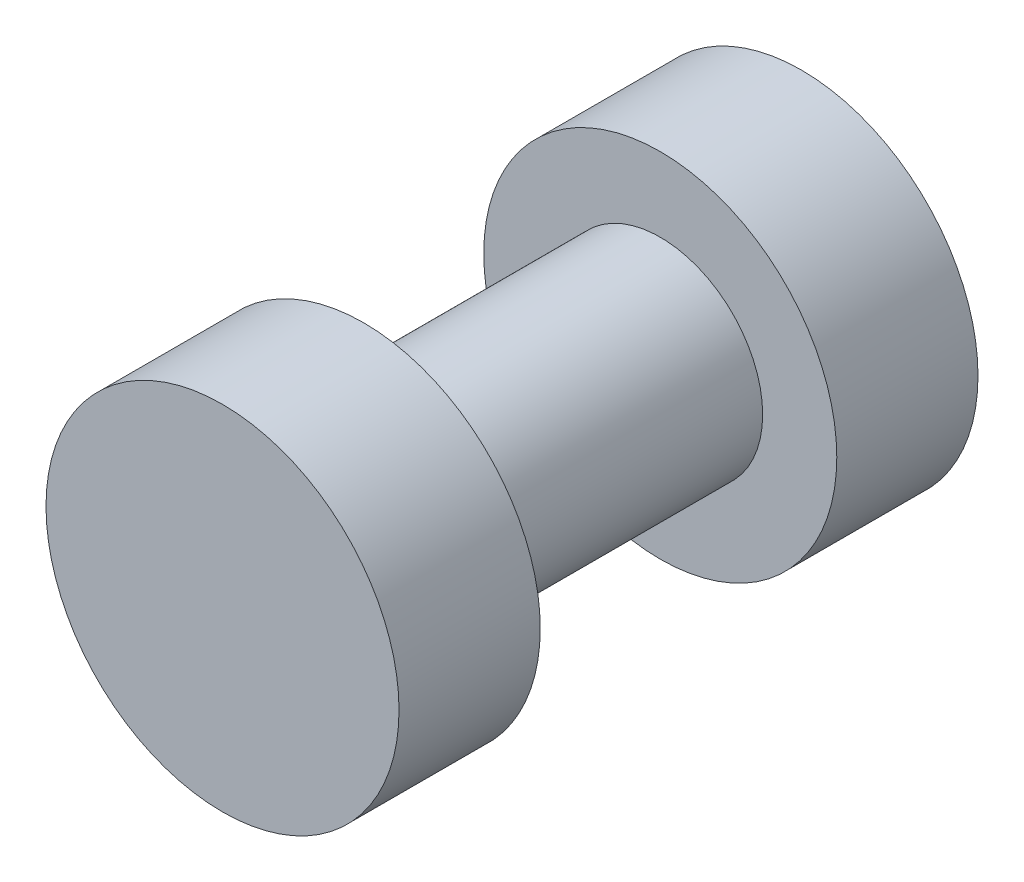
ISO-10303-21;
HEADER;
FILE_DESCRIPTION(('STEP AP214'),'2;1');
FILE_NAME('part.step','',(''),(''),'','','');
FILE_SCHEMA(('AUTOMOTIVE_DESIGN { 1 0 10303 214 1 1 1 1 }'));
ENDSEC;
DATA;
#1=APPLICATION_CONTEXT('core data for automotive mechanical design processes');
#2=APPLICATION_PROTOCOL_DEFINITION('international standard','automotive_design',2000,#1);
#3=PRODUCT_CONTEXT('',#1,'mechanical');
#4=PRODUCT('Part','Part','',(#3));
#5=PRODUCT_RELATED_PRODUCT_CATEGORY('part','',(#4));
#6=PRODUCT_DEFINITION_FORMATION('','',#4);
#7=PRODUCT_DEFINITION_CONTEXT('part definition',#1,'design');
#8=PRODUCT_DEFINITION('design','',#6,#7);
#9=PRODUCT_DEFINITION_SHAPE('','',#8);
#10=(LENGTH_UNIT() NAMED_UNIT(*) SI_UNIT(.MILLI.,.METRE.));
#11=(NAMED_UNIT(*) PLANE_ANGLE_UNIT() SI_UNIT($,.RADIAN.));
#12=(NAMED_UNIT(*) SI_UNIT($,.STERADIAN.) SOLID_ANGLE_UNIT());
#13=UNCERTAINTY_MEASURE_WITH_UNIT(LENGTH_MEASURE(1.E-05),#10,'distance_accuracy_value','');
#14=(GEOMETRIC_REPRESENTATION_CONTEXT(3) GLOBAL_UNCERTAINTY_ASSIGNED_CONTEXT((#13)) GLOBAL_UNIT_ASSIGNED_CONTEXT((#10,
#11,#12)) REPRESENTATION_CONTEXT('',''));
#15=CARTESIAN_POINT('',(0.,0.,0.));
#16=DIRECTION('',(0.,0.,1.));
#17=DIRECTION('',(1.,0.,0.));
#18=AXIS2_PLACEMENT_3D('',#15,#16,#17);
#19=CARTESIAN_POINT('',(0.,0.,10.));
#20=DIRECTION('',(0.,0.,-1.));
#21=DIRECTION('',(-1.,0.,0.));
#22=AXIS2_PLACEMENT_3D('',#19,#20,#21);
#23=CYLINDRICAL_SURFACE('',#22,12.5);
#24=CARTESIAN_POINT('',(0.,0.,10.));
#25=DIRECTION('',(0.,0.,1.));
#26=DIRECTION('',(1.,0.,0.));
#27=AXIS2_PLACEMENT_3D('',#24,#25,#26);
#28=CIRCLE('',#27,12.5);
#29=CARTESIAN_POINT('',(12.5,0.,10.));
#30=VERTEX_POINT('',#29);
#31=EDGE_CURVE('E38',#30,#30,#28,.T.);
#32=ORIENTED_EDGE('',*,*,#31,.F.);
#33=EDGE_LOOP('',(#32));
#34=FACE_BOUND('',#33,.T.);
#35=CARTESIAN_POINT('',(0.,0.,0.));
#36=DIRECTION('',(0.,0.,1.));
#37=DIRECTION('',(1.,0.,0.));
#38=AXIS2_PLACEMENT_3D('',#35,#36,#37);
#39=CIRCLE('',#38,12.5);
#40=CARTESIAN_POINT('',(12.5,0.,0.));
#41=VERTEX_POINT('',#40);
#42=EDGE_CURVE('E34',#41,#41,#39,.T.);
#43=ORIENTED_EDGE('',*,*,#42,.T.);
#44=EDGE_LOOP('',(#43));
#45=FACE_BOUND('',#44,.T.);
#46=ADVANCED_FACE('F31',(#34,#45),#23,.T.);
#47=CARTESIAN_POINT('',(0.,0.,10.));
#48=DIRECTION('',(0.,0.,1.));
#49=DIRECTION('',(1.,0.,0.));
#50=AXIS2_PLACEMENT_3D('',#47,#48,#49);
#51=PLANE('',#50);
#52=CARTESIAN_POINT('',(0.,0.,10.));
#53=DIRECTION('',(0.,0.,1.));
#54=DIRECTION('',(1.,0.,0.));
#55=AXIS2_PLACEMENT_3D('',#52,#53,#54);
#56=CIRCLE('',#55,7.25);
#57=CARTESIAN_POINT('',(-7.25,0.,10.));
#58=VERTEX_POINT('',#57);
#59=EDGE_CURVE('E10',#58,#58,#56,.T.);
#60=ORIENTED_EDGE('',*,*,#59,.F.);
#61=EDGE_LOOP('',(#60));
#62=FACE_BOUND('',#61,.T.);
#63=ORIENTED_EDGE('',*,*,#31,.T.);
#64=EDGE_LOOP('',(#63));
#65=FACE_BOUND('',#64,.T.);
#66=ADVANCED_FACE('F72',(#62,#65),#51,.T.);
#67=CARTESIAN_POINT('',(0.,0.,0.));
#68=DIRECTION('',(0.,0.,1.));
#69=DIRECTION('',(1.,0.,0.));
#70=AXIS2_PLACEMENT_3D('',#67,#68,#69);
#71=PLANE('',#70);
#72=ORIENTED_EDGE('',*,*,#42,.F.);
#73=EDGE_LOOP('',(#72));
#74=FACE_BOUND('',#73,.T.);
#75=ADVANCED_FACE('F77',(#74),#71,.F.);
#76=CARTESIAN_POINT('',(0.,0.,31.));
#77=DIRECTION('',(0.,0.,-1.));
#78=DIRECTION('',(-1.,0.,0.));
#79=AXIS2_PLACEMENT_3D('',#76,#77,#78);
#80=CYLINDRICAL_SURFACE('',#79,7.25);
#81=CARTESIAN_POINT('',(0.,0.,31.));
#82=DIRECTION('',(0.,0.,1.));
#83=DIRECTION('',(1.,0.,0.));
#84=AXIS2_PLACEMENT_3D('',#81,#82,#83);
#85=CIRCLE('',#84,7.25);
#86=CARTESIAN_POINT('',(-7.25,0.,31.));
#87=VERTEX_POINT('',#86);
#88=EDGE_CURVE('E44',#87,#87,#85,.T.);
#89=CARTESIAN_POINT('',(-7.25,0.,31.));
#90=CARTESIAN_POINT('',(-7.25,0.,30.78125));
#91=CARTESIAN_POINT('',(-7.25,0.,30.5625));
#92=CARTESIAN_POINT('',(-7.25,0.,30.125));
#93=CARTESIAN_POINT('',(-7.25,0.,29.90625));
#94=CARTESIAN_POINT('',(-7.25,0.,29.46875));
#95=CARTESIAN_POINT('',(-7.25,0.,29.25));
#96=CARTESIAN_POINT('',(-7.25,0.,28.8125));
#97=CARTESIAN_POINT('',(-7.25,0.,28.59375));
#98=CARTESIAN_POINT('',(-7.25,0.,28.15625));
#99=CARTESIAN_POINT('',(-7.25,0.,27.9375));
#100=CARTESIAN_POINT('',(-7.25,0.,27.5));
#101=CARTESIAN_POINT('',(-7.25,0.,27.28125));
#102=CARTESIAN_POINT('',(-7.25,0.,26.84375));
#103=CARTESIAN_POINT('',(-7.25,0.,26.625));
#104=CARTESIAN_POINT('',(-7.25,0.,26.1875));
#105=CARTESIAN_POINT('',(-7.25,0.,25.96875));
#106=CARTESIAN_POINT('',(-7.25,0.,25.53125));
#107=CARTESIAN_POINT('',(-7.25,0.,25.3125));
#108=CARTESIAN_POINT('',(-7.25,0.,24.875));
#109=CARTESIAN_POINT('',(-7.25,0.,24.65625));
#110=CARTESIAN_POINT('',(-7.25,0.,24.21875));
#111=CARTESIAN_POINT('',(-7.25,0.,24.));
#112=CARTESIAN_POINT('',(-7.25,0.,23.5625));
#113=CARTESIAN_POINT('',(-7.25,0.,23.34375));
#114=CARTESIAN_POINT('',(-7.25,0.,22.90625));
#115=CARTESIAN_POINT('',(-7.25,0.,22.6875));
#116=CARTESIAN_POINT('',(-7.25,0.,22.25));
#117=CARTESIAN_POINT('',(-7.25,0.,22.03125));
#118=CARTESIAN_POINT('',(-7.25,0.,21.59375));
#119=CARTESIAN_POINT('',(-7.25,0.,21.375));
#120=CARTESIAN_POINT('',(-7.25,0.,20.9375));
#121=CARTESIAN_POINT('',(-7.25,0.,20.71875));
#122=CARTESIAN_POINT('',(-7.25,0.,20.28125));
#123=CARTESIAN_POINT('',(-7.25,0.,20.0625));
#124=CARTESIAN_POINT('',(-7.25,0.,19.625));
#125=CARTESIAN_POINT('',(-7.25,0.,19.40625));
#126=CARTESIAN_POINT('',(-7.25,0.,18.96875));
#127=CARTESIAN_POINT('',(-7.25,0.,18.75));
#128=CARTESIAN_POINT('',(-7.25,0.,18.3125));
#129=CARTESIAN_POINT('',(-7.25,0.,18.09375));
#130=CARTESIAN_POINT('',(-7.25,0.,17.65625));
#131=CARTESIAN_POINT('',(-7.25,0.,17.4375));
#132=CARTESIAN_POINT('',(-7.25,0.,17.));
#133=CARTESIAN_POINT('',(-7.25,0.,16.78125));
#134=CARTESIAN_POINT('',(-7.25,0.,16.34375));
#135=CARTESIAN_POINT('',(-7.25,0.,16.125));
#136=CARTESIAN_POINT('',(-7.25,0.,15.6875));
#137=CARTESIAN_POINT('',(-7.25,0.,15.46875));
#138=CARTESIAN_POINT('',(-7.25,0.,15.03125));
#139=CARTESIAN_POINT('',(-7.25,0.,14.8125));
#140=CARTESIAN_POINT('',(-7.25,0.,14.375));
#141=CARTESIAN_POINT('',(-7.25,0.,14.15625));
#142=CARTESIAN_POINT('',(-7.25,0.,13.71875));
#143=CARTESIAN_POINT('',(-7.25,0.,13.5));
#144=CARTESIAN_POINT('',(-7.25,0.,13.0625));
#145=CARTESIAN_POINT('',(-7.25,0.,12.84375));
#146=CARTESIAN_POINT('',(-7.25,0.,12.40625));
#147=CARTESIAN_POINT('',(-7.25,0.,12.1875));
#148=CARTESIAN_POINT('',(-7.25,0.,11.75));
#149=CARTESIAN_POINT('',(-7.25,0.,11.53125));
#150=CARTESIAN_POINT('',(-7.25,0.,11.09375));
#151=CARTESIAN_POINT('',(-7.25,0.,10.875));
#152=CARTESIAN_POINT('',(-7.25,0.,10.4375));
#153=CARTESIAN_POINT('',(-7.25,0.,10.21875));
#154=CARTESIAN_POINT('',(-7.25,0.,10.));
#155=B_SPLINE_CURVE_WITH_KNOTS('',3,(#89,#90,#91,#92,#93,#94,#95,#96,#97,#98,#99,#100,#101,#102,
#103,#104,#105,#106,#107,#108,#109,#110,#111,#112,#113,#114,#115,#116,#117,#118,#119,#120,#121,
#122,#123,#124,#125,#126,#127,#128,#129,#130,#131,#132,#133,#134,#135,#136,#137,#138,#139,#140,
#141,#142,#143,#144,#145,#146,#147,#148,#149,#150,#151,#152,#153,#154),.UNSPECIFIED.,.F.,.F.,(4,
2,2,2,2,2,2,2,2,2,2,2,2,2,2,2,2,2,2,2,2,2,2,2,2,2,2,2,2,2,2,2,4),(0.,0.656249999999997,1.3125,
1.96875,2.625,3.28125,3.9375,4.59375,5.25,5.90625,6.5625,7.21875,7.875,8.53125,9.1875,
9.84374999999999,10.5,11.15625,11.8125,12.46875,13.125,13.78125,14.4375,15.09375,15.75,16.40625,
17.0625,17.71875,18.375,19.03125,19.6875,20.34375,21.),.UNSPECIFIED.);
#156=EDGE_CURVE('BSEAM59',#87,#58,#155,.T.);
#157=ORIENTED_EDGE('',*,*,#88,.F.);
#158=ORIENTED_EDGE('',*,*,#59,.T.);
#159=ORIENTED_EDGE('',*,*,#156,.T.);
#160=ORIENTED_EDGE('',*,*,#156,.F.);
#161=EDGE_LOOP('',(#157,#159,#158,#160));
#162=FACE_BOUND('',#161,.T.);
#163=ADVANCED_FACE('F59',(#162),#80,.T.);
#164=CARTESIAN_POINT('',(0.,0.,41.));
#165=DIRECTION('',(0.,0.,-1.));
#166=DIRECTION('',(-1.,0.,0.));
#167=AXIS2_PLACEMENT_3D('',#164,#165,#166);
#168=CYLINDRICAL_SURFACE('',#167,12.5);
#169=CARTESIAN_POINT('',(0.,0.,41.));
#170=DIRECTION('',(0.,0.,1.));
#171=DIRECTION('',(1.,0.,0.));
#172=AXIS2_PLACEMENT_3D('',#169,#170,#171);
#173=CIRCLE('',#172,12.5);
#174=CARTESIAN_POINT('',(12.5,0.,41.));
#175=VERTEX_POINT('',#174);
#176=EDGE_CURVE('E47',#175,#175,#173,.T.);
#177=ORIENTED_EDGE('',*,*,#176,.F.);
#178=EDGE_LOOP('',(#177));
#179=FACE_BOUND('',#178,.T.);
#180=CARTESIAN_POINT('',(0.,0.,31.));
#181=DIRECTION('',(0.,0.,1.));
#182=DIRECTION('',(1.,0.,0.));
#183=AXIS2_PLACEMENT_3D('',#180,#181,#182);
#184=CIRCLE('',#183,12.5);
#185=CARTESIAN_POINT('',(12.5,0.,31.));
#186=VERTEX_POINT('',#185);
#187=EDGE_CURVE('E48',#186,#186,#184,.T.);
#188=ORIENTED_EDGE('',*,*,#187,.T.);
#189=EDGE_LOOP('',(#188));
#190=FACE_BOUND('',#189,.T.);
#191=ADVANCED_FACE('F56',(#179,#190),#168,.T.);
#192=CARTESIAN_POINT('',(0.,0.,41.));
#193=DIRECTION('',(0.,0.,1.));
#194=DIRECTION('',(1.,0.,0.));
#195=AXIS2_PLACEMENT_3D('',#192,#193,#194);
#196=PLANE('',#195);
#197=ORIENTED_EDGE('',*,*,#176,.T.);
#198=EDGE_LOOP('',(#197));
#199=FACE_BOUND('',#198,.T.);
#200=ADVANCED_FACE('F54',(#199),#196,.T.);
#201=CARTESIAN_POINT('',(0.,0.,31.));
#202=DIRECTION('',(0.,0.,1.));
#203=DIRECTION('',(1.,0.,0.));
#204=AXIS2_PLACEMENT_3D('',#201,#202,#203);
#205=PLANE('',#204);
#206=ORIENTED_EDGE('',*,*,#88,.T.);
#207=EDGE_LOOP('',(#206));
#208=FACE_BOUND('',#207,.T.);
#209=ORIENTED_EDGE('',*,*,#187,.F.);
#210=EDGE_LOOP('',(#209));
#211=FACE_BOUND('',#210,.T.);
#212=ADVANCED_FACE('F63',(#208,#211),#205,.F.);
#213=CLOSED_SHELL('',(#46,#66,#75,#163,#191,#200,#212));
#214=MANIFOLD_SOLID_BREP('B2',#213);
#215=ADVANCED_BREP_SHAPE_REPRESENTATION('',(#18,#214),#14);
#216=SHAPE_DEFINITION_REPRESENTATION(#9,#215);
ENDSEC;
END-ISO-10303-21;
